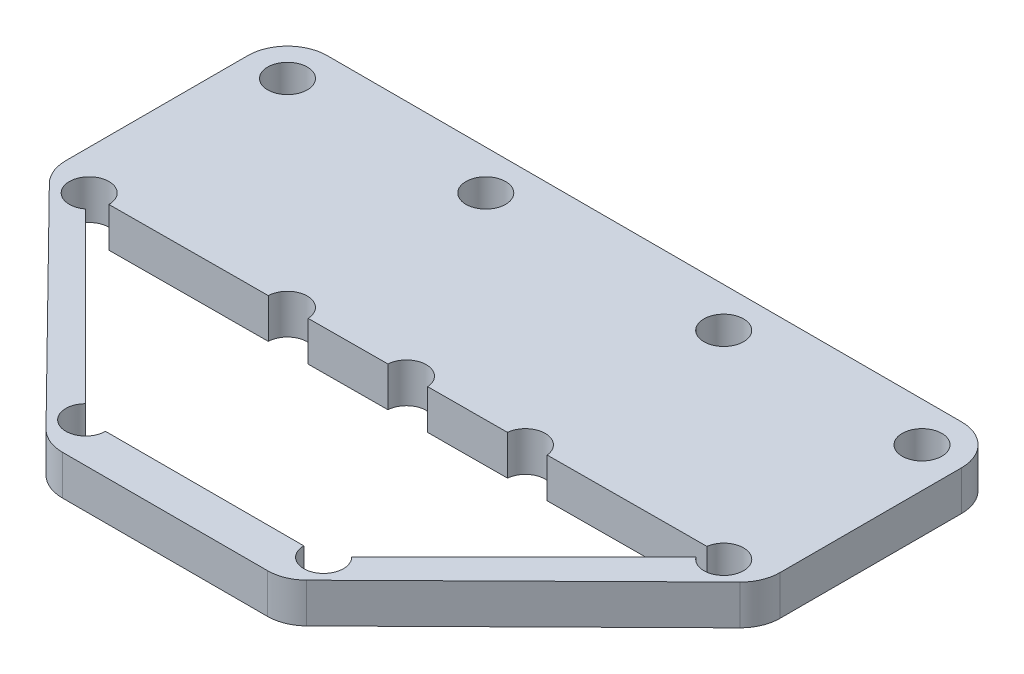
ISO-10303-21;
HEADER;
FILE_DESCRIPTION(('STEP AP214'),'2;1');
FILE_NAME('part.step','',(''),(''),'','','');
FILE_SCHEMA(('AUTOMOTIVE_DESIGN { 1 0 10303 214 1 1 1 1 }'));
ENDSEC;
DATA;
#1=APPLICATION_CONTEXT('core data for automotive mechanical design processes');
#2=APPLICATION_PROTOCOL_DEFINITION('international standard','automotive_design',2000,#1);
#3=PRODUCT_CONTEXT('',#1,'mechanical');
#4=PRODUCT('Part','Part','',(#3));
#5=PRODUCT_RELATED_PRODUCT_CATEGORY('part','',(#4));
#6=PRODUCT_DEFINITION_FORMATION('','',#4);
#7=PRODUCT_DEFINITION_CONTEXT('part definition',#1,'design');
#8=PRODUCT_DEFINITION('design','',#6,#7);
#9=PRODUCT_DEFINITION_SHAPE('','',#8);
#10=(LENGTH_UNIT() NAMED_UNIT(*) SI_UNIT(.MILLI.,.METRE.));
#11=(NAMED_UNIT(*) PLANE_ANGLE_UNIT() SI_UNIT($,.RADIAN.));
#12=(NAMED_UNIT(*) SI_UNIT($,.STERADIAN.) SOLID_ANGLE_UNIT());
#13=UNCERTAINTY_MEASURE_WITH_UNIT(LENGTH_MEASURE(1.E-05),#10,'distance_accuracy_value','');
#14=(GEOMETRIC_REPRESENTATION_CONTEXT(3) GLOBAL_UNCERTAINTY_ASSIGNED_CONTEXT((#13)) GLOBAL_UNIT_ASSIGNED_CONTEXT((#10,
#11,#12)) REPRESENTATION_CONTEXT('',''));
#15=CARTESIAN_POINT('',(0.,0.,0.));
#16=DIRECTION('',(0.,0.,1.));
#17=DIRECTION('',(1.,0.,0.));
#18=AXIS2_PLACEMENT_3D('',#15,#16,#17);
#19=CARTESIAN_POINT('',(-131.471489952786,12.7,-38.2334337337742));
#20=DIRECTION('',(0.,-1.,0.));
#21=DIRECTION('',(0.,0.,-1.));
#22=AXIS2_PLACEMENT_3D('',#19,#20,#21);
#23=CYLINDRICAL_SURFACE('',#22,12.6999999999999);
#24=CARTESIAN_POINT('',(-131.471489952786,0.,-38.2334337337742));
#25=DIRECTION('',(0.,1.,0.));
#26=DIRECTION('',(0.,0.,-1.));
#27=AXIS2_PLACEMENT_3D('',#24,#25,#26);
#28=CIRCLE('',#27,12.6999999999999);
#29=CARTESIAN_POINT('',(-144.171489952786,0.,-38.2334337337742));
#30=VERTEX_POINT('',#29);
#31=CARTESIAN_POINT('',(-140.522107102558,0.,-29.3240942965171));
#32=VERTEX_POINT('',#31);
#33=EDGE_CURVE('E259',#30,#32,#28,.T.);
#34=ORIENTED_EDGE('',*,*,#33,.T.);
#35=DIRECTION('',(0.,-1.,0.));
#36=VECTOR('',#35,1.);
#37=CARTESIAN_POINT('',(-140.522107102558,12.7,-29.3240942965171));
#38=LINE('',#37,#36);
#39=CARTESIAN_POINT('',(-140.522107102558,12.7,-29.3240942965171));
#40=VERTEX_POINT('',#39);
#41=EDGE_CURVE('E382',#40,#32,#38,.T.);
#42=ORIENTED_EDGE('',*,*,#41,.F.);
#43=CARTESIAN_POINT('',(-131.471489952786,12.7,-38.2334337337742));
#44=DIRECTION('',(0.,1.,0.));
#45=DIRECTION('',(0.,0.,-1.));
#46=AXIS2_PLACEMENT_3D('',#43,#44,#45);
#47=CIRCLE('',#46,12.6999999999999);
#48=CARTESIAN_POINT('',(-144.171489952786,12.7,-38.2334337337742));
#49=VERTEX_POINT('',#48);
#50=EDGE_CURVE('E265',#49,#40,#47,.T.);
#51=ORIENTED_EDGE('',*,*,#50,.F.);
#52=DIRECTION('',(0.,-1.,0.));
#53=VECTOR('',#52,1.);
#54=CARTESIAN_POINT('',(-144.171489952786,12.7,-38.2334337337742));
#55=LINE('',#54,#53);
#56=EDGE_CURVE('E303',#49,#30,#55,.T.);
#57=ORIENTED_EDGE('',*,*,#56,.T.);
#58=EDGE_LOOP('',(#34,#42,#51,#57));
#59=FACE_BOUND('',#58,.T.);
#60=ADVANCED_FACE('F39',(#59),#23,.T.);
#61=CARTESIAN_POINT('',(-140.522107102558,12.7,-29.3240942965171));
#62=DIRECTION('',(0.712647019667029,0.,-0.701522790335211));
#63=DIRECTION('',(-0.701522790335211,0.,-0.712647019667029));
#64=AXIS2_PLACEMENT_3D('',#61,#62,#63);
#65=PLANE('',#64);
#66=DIRECTION('',(0.701522790335211,0.,0.712647019667029));
#67=VECTOR('',#66,1.);
#68=CARTESIAN_POINT('',(-140.522107102558,0.,-29.3240942965171));
#69=LINE('',#68,#67);
#70=CARTESIAN_POINT('',(-72.8924409334163,0.,39.3779930775579));
#71=VERTEX_POINT('',#70);
#72=EDGE_CURVE('E307',#32,#71,#69,.T.);
#73=ORIENTED_EDGE('',*,*,#72,.T.);
#74=DIRECTION('',(0.,-1.,0.));
#75=VECTOR('',#74,1.);
#76=CARTESIAN_POINT('',(-72.8924409334163,12.7,39.3779930775579));
#77=LINE('',#76,#75);
#78=CARTESIAN_POINT('',(-72.8924409334163,12.7,39.3779930775579));
#79=VERTEX_POINT('',#78);
#80=EDGE_CURVE('E378',#79,#71,#77,.T.);
#81=ORIENTED_EDGE('',*,*,#80,.F.);
#82=DIRECTION('',(0.701522790335211,0.,0.712647019667029));
#83=VECTOR('',#82,1.);
#84=CARTESIAN_POINT('',(-140.522107102558,12.7,-29.3240942965171));
#85=LINE('',#84,#83);
#86=EDGE_CURVE('E269',#40,#79,#85,.T.);
#87=ORIENTED_EDGE('',*,*,#86,.F.);
#88=ORIENTED_EDGE('',*,*,#41,.T.);
#89=EDGE_LOOP('',(#73,#81,#87,#88));
#90=FACE_BOUND('',#89,.T.);
#91=ADVANCED_FACE('F548',(#90),#65,.F.);
#92=CARTESIAN_POINT('',(-63.8418237836473,12.7,30.4686536403008));
#93=DIRECTION('',(0.,-1.,0.));
#94=DIRECTION('',(0.,0.,-1.));
#95=AXIS2_PLACEMENT_3D('',#92,#93,#94);
#96=CYLINDRICAL_SURFACE('',#95,12.6999999999992);
#97=CARTESIAN_POINT('',(-63.8418237836473,0.,30.4686536403008));
#98=DIRECTION('',(0.,1.,0.));
#99=DIRECTION('',(0.,0.,-1.));
#100=AXIS2_PLACEMENT_3D('',#97,#98,#99);
#101=CIRCLE('',#100,12.6999999999992);
#102=CARTESIAN_POINT('',(-63.8418237836451,0.,43.1686536402999));
#103=VERTEX_POINT('',#102);
#104=EDGE_CURVE('E310',#71,#103,#101,.T.);
#105=ORIENTED_EDGE('',*,*,#104,.T.);
#106=DIRECTION('',(0.,-1.,0.));
#107=VECTOR('',#106,1.);
#108=CARTESIAN_POINT('',(-63.8418237836451,12.7,43.1686536402999));
#109=LINE('',#108,#107);
#110=CARTESIAN_POINT('',(-63.8418237836451,12.7,43.1686536402999));
#111=VERTEX_POINT('',#110);
#112=EDGE_CURVE('E374',#111,#103,#109,.T.);
#113=ORIENTED_EDGE('',*,*,#112,.F.);
#114=CARTESIAN_POINT('',(-63.8418237836473,12.7,30.4686536403008));
#115=DIRECTION('',(0.,1.,0.));
#116=DIRECTION('',(0.,0.,-1.));
#117=AXIS2_PLACEMENT_3D('',#114,#115,#116);
#118=CIRCLE('',#117,12.6999999999992);
#119=EDGE_CURVE('E273',#79,#111,#118,.T.);
#120=ORIENTED_EDGE('',*,*,#119,.F.);
#121=ORIENTED_EDGE('',*,*,#80,.T.);
#122=EDGE_LOOP('',(#105,#113,#120,#121));
#123=FACE_BOUND('',#122,.T.);
#124=ADVANCED_FACE('F553',(#123),#96,.T.);
#125=CARTESIAN_POINT('',(-63.8418237836451,12.7,43.1686536403008));
#126=DIRECTION('',(0.,0.,-1.));
#127=DIRECTION('',(-1.,0.,0.));
#128=AXIS2_PLACEMENT_3D('',#125,#126,#127);
#129=PLANE('',#128);
#130=DIRECTION('',(1.,0.,0.));
#131=VECTOR('',#130,1.);
#132=CARTESIAN_POINT('',(-63.8418237836451,0.,43.1686536403008));
#133=LINE('',#132,#131);
#134=CARTESIAN_POINT('',(1.83605760066149,0.,43.1686536403007));
#135=VERTEX_POINT('',#134);
#136=EDGE_CURVE('E313',#103,#135,#133,.T.);
#137=ORIENTED_EDGE('',*,*,#136,.T.);
#138=DIRECTION('',(0.,-1.,0.));
#139=VECTOR('',#138,1.);
#140=CARTESIAN_POINT('',(1.83605760066149,12.7,43.1686536403007));
#141=LINE('',#140,#139);
#142=CARTESIAN_POINT('',(1.83605760066149,12.7,43.1686536403007));
#143=VERTEX_POINT('',#142);
#144=EDGE_CURVE('E370',#143,#135,#141,.T.);
#145=ORIENTED_EDGE('',*,*,#144,.F.);
#146=DIRECTION('',(1.,0.,0.));
#147=VECTOR('',#146,1.);
#148=CARTESIAN_POINT('',(-63.8418237836451,12.7,43.1686536403008));
#149=LINE('',#148,#147);
#150=EDGE_CURVE('E276',#111,#143,#149,.T.);
#151=ORIENTED_EDGE('',*,*,#150,.F.);
#152=ORIENTED_EDGE('',*,*,#112,.T.);
#153=EDGE_LOOP('',(#137,#145,#151,#152));
#154=FACE_BOUND('',#153,.T.);
#155=ADVANCED_FACE('F605',(#154),#129,.F.);
#156=CARTESIAN_POINT('',(1.83605760065925,12.7,30.4686536403008));
#157=DIRECTION('',(0.,-1.,0.));
#158=DIRECTION('',(0.,0.,-1.));
#159=AXIS2_PLACEMENT_3D('',#156,#157,#158);
#160=CYLINDRICAL_SURFACE('',#159,12.7000000000008);
#161=CARTESIAN_POINT('',(1.83605760065925,0.,30.4686536403008));
#162=DIRECTION('',(0.,1.,0.));
#163=DIRECTION('',(0.,0.,-1.));
#164=AXIS2_PLACEMENT_3D('',#161,#162,#163);
#165=CIRCLE('',#164,12.7000000000008);
#166=CARTESIAN_POINT('',(10.7464996254383,0.,39.5181852813897));
#167=VERTEX_POINT('',#166);
#168=EDGE_CURVE('E316',#135,#167,#165,.T.);
#169=ORIENTED_EDGE('',*,*,#168,.T.);
#170=DIRECTION('',(0.,-1.,0.));
#171=VECTOR('',#170,1.);
#172=CARTESIAN_POINT('',(10.7464996254383,12.7,39.5181852813897));
#173=LINE('',#172,#171);
#174=CARTESIAN_POINT('',(10.7464996254383,12.7,39.5181852813897));
#175=VERTEX_POINT('',#174);
#176=EDGE_CURVE('E366',#175,#167,#173,.T.);
#177=ORIENTED_EDGE('',*,*,#176,.F.);
#178=CARTESIAN_POINT('',(1.83605760065925,12.7,30.4686536403008));
#179=DIRECTION('',(0.,1.,0.));
#180=DIRECTION('',(0.,0.,-1.));
#181=AXIS2_PLACEMENT_3D('',#178,#179,#180);
#182=CIRCLE('',#181,12.7000000000008);
#183=EDGE_CURVE('E279',#143,#175,#182,.T.);
#184=ORIENTED_EDGE('',*,*,#183,.F.);
#185=ORIENTED_EDGE('',*,*,#144,.T.);
#186=EDGE_LOOP('',(#169,#177,#184,#185));
#187=FACE_BOUND('',#186,.T.);
#188=ADVANCED_FACE('F602',(#187),#160,.T.);
#189=CARTESIAN_POINT('',(80.6389520719911,12.7,-29.3000331849449));
#190=DIRECTION('',(-0.701609608250188,0.,-0.712561546542485));
#191=DIRECTION('',(-0.712561546542485,0.,0.701609608250188));
#192=AXIS2_PLACEMENT_3D('',#189,#190,#191);
#193=PLANE('',#192);
#194=DIRECTION('',(0.712561546542485,0.,-0.701609608250188));
#195=VECTOR('',#194,1.);
#196=CARTESIAN_POINT('',(80.6389520719911,0.,-29.3000331849449));
#197=LINE('',#196,#195);
#198=CARTESIAN_POINT('',(80.6389520719911,0.,-29.3000331849449));
#199=VERTEX_POINT('',#198);
#200=EDGE_CURVE('E319',#167,#199,#197,.T.);
#201=ORIENTED_EDGE('',*,*,#200,.T.);
#202=DIRECTION('',(0.,-1.,0.));
#203=VECTOR('',#202,1.);
#204=CARTESIAN_POINT('',(80.6389520719911,12.7,-29.3000331849449));
#205=LINE('',#204,#203);
#206=CARTESIAN_POINT('',(80.6389520719911,12.7,-29.3000331849449));
#207=VERTEX_POINT('',#206);
#208=EDGE_CURVE('E362',#207,#199,#205,.T.);
#209=ORIENTED_EDGE('',*,*,#208,.F.);
#210=DIRECTION('',(0.712561546542485,0.,-0.701609608250188));
#211=VECTOR('',#210,1.);
#212=CARTESIAN_POINT('',(80.6389520719911,12.7,-29.3000331849449));
#213=LINE('',#212,#211);
#214=EDGE_CURVE('E282',#175,#207,#213,.T.);
#215=ORIENTED_EDGE('',*,*,#214,.F.);
#216=ORIENTED_EDGE('',*,*,#176,.T.);
#217=EDGE_LOOP('',(#201,#209,#215,#216));
#218=FACE_BOUND('',#217,.T.);
#219=ADVANCED_FACE('F598',(#218),#193,.F.);
#220=CARTESIAN_POINT('',(71.7285100472137,12.7,-38.3495648260345));
#221=DIRECTION('',(0.,-1.,0.));
#222=DIRECTION('',(0.,0.,-1.));
#223=AXIS2_PLACEMENT_3D('',#220,#221,#222);
#224=CYLINDRICAL_SURFACE('',#223,12.7);
#225=CARTESIAN_POINT('',(71.7285100472137,0.,-38.3495648260345));
#226=DIRECTION('',(0.,1.,0.));
#227=DIRECTION('',(0.,0.,-1.));
#228=AXIS2_PLACEMENT_3D('',#225,#226,#227);
#229=CIRCLE('',#228,12.7);
#230=CARTESIAN_POINT('',(84.4285100472137,0.,-38.3495648260345));
#231=VERTEX_POINT('',#230);
#232=EDGE_CURVE('E322',#199,#231,#229,.T.);
#233=ORIENTED_EDGE('',*,*,#232,.T.);
#234=DIRECTION('',(0.,-1.,0.));
#235=VECTOR('',#234,1.);
#236=CARTESIAN_POINT('',(84.4285100472137,12.7,-38.3495648260345));
#237=LINE('',#236,#235);
#238=CARTESIAN_POINT('',(84.4285100472137,12.7,-38.3495648260345));
#239=VERTEX_POINT('',#238);
#240=EDGE_CURVE('E358',#239,#231,#237,.T.);
#241=ORIENTED_EDGE('',*,*,#240,.F.);
#242=CARTESIAN_POINT('',(71.7285100472137,12.7,-38.3495648260345));
#243=DIRECTION('',(0.,1.,0.));
#244=DIRECTION('',(0.,0.,-1.));
#245=AXIS2_PLACEMENT_3D('',#242,#243,#244);
#246=CIRCLE('',#245,12.7);
#247=EDGE_CURVE('E285',#207,#239,#246,.T.);
#248=ORIENTED_EDGE('',*,*,#247,.F.);
#249=ORIENTED_EDGE('',*,*,#208,.T.);
#250=EDGE_LOOP('',(#233,#241,#248,#249));
#251=FACE_BOUND('',#250,.T.);
#252=ADVANCED_FACE('F593',(#251),#224,.T.);
#253=CARTESIAN_POINT('',(84.4285100472137,12.7,-96.5313463596992));
#254=DIRECTION('',(-1.,0.,0.));
#255=DIRECTION('',(0.,0.,1.));
#256=AXIS2_PLACEMENT_3D('',#253,#254,#255);
#257=PLANE('',#256);
#258=DIRECTION('',(0.,0.,-1.));
#259=VECTOR('',#258,1.);
#260=CARTESIAN_POINT('',(84.4285100472137,0.,-96.5313463596992));
#261=LINE('',#260,#259);
#262=CARTESIAN_POINT('',(84.4285100472137,0.,-96.5313463596992));
#263=VERTEX_POINT('',#262);
#264=EDGE_CURVE('E325',#231,#263,#261,.T.);
#265=ORIENTED_EDGE('',*,*,#264,.T.);
#266=DIRECTION('',(0.,-1.,0.));
#267=VECTOR('',#266,1.);
#268=CARTESIAN_POINT('',(84.4285100472137,12.7,-96.5313463596992));
#269=LINE('',#268,#267);
#270=CARTESIAN_POINT('',(84.4285100472137,12.7,-96.5313463596992));
#271=VERTEX_POINT('',#270);
#272=EDGE_CURVE('E354',#271,#263,#269,.T.);
#273=ORIENTED_EDGE('',*,*,#272,.F.);
#274=DIRECTION('',(0.,0.,-1.));
#275=VECTOR('',#274,1.);
#276=CARTESIAN_POINT('',(84.4285100472137,12.7,-96.5313463596992));
#277=LINE('',#276,#275);
#278=EDGE_CURVE('E288',#239,#271,#277,.T.);
#279=ORIENTED_EDGE('',*,*,#278,.F.);
#280=ORIENTED_EDGE('',*,*,#240,.T.);
#281=EDGE_LOOP('',(#265,#273,#279,#280));
#282=FACE_BOUND('',#281,.T.);
#283=ADVANCED_FACE('F587',(#282),#257,.F.);
#284=CARTESIAN_POINT('',(71.7285100472137,12.7,-96.5313463596993));
#285=DIRECTION('',(0.,-1.,0.));
#286=DIRECTION('',(0.,0.,-1.));
#287=AXIS2_PLACEMENT_3D('',#284,#285,#286);
#288=CYLINDRICAL_SURFACE('',#287,12.7);
#289=CARTESIAN_POINT('',(71.7285100472137,0.,-96.5313463596993));
#290=DIRECTION('',(0.,1.,0.));
#291=DIRECTION('',(0.,0.,1.));
#292=AXIS2_PLACEMENT_3D('',#289,#290,#291);
#293=CIRCLE('',#292,12.7);
#294=CARTESIAN_POINT('',(71.7285100472136,0.,-109.231346359699));
#295=VERTEX_POINT('',#294);
#296=EDGE_CURVE('E328',#263,#295,#293,.T.);
#297=ORIENTED_EDGE('',*,*,#296,.T.);
#298=DIRECTION('',(0.,-1.,0.));
#299=VECTOR('',#298,1.);
#300=CARTESIAN_POINT('',(71.7285100472136,12.7,-109.231346359699));
#301=LINE('',#300,#299);
#302=CARTESIAN_POINT('',(71.7285100472136,12.7,-109.231346359699));
#303=VERTEX_POINT('',#302);
#304=EDGE_CURVE('E350',#303,#295,#301,.T.);
#305=ORIENTED_EDGE('',*,*,#304,.F.);
#306=CARTESIAN_POINT('',(71.7285100472137,12.7,-96.5313463596993));
#307=DIRECTION('',(0.,1.,0.));
#308=DIRECTION('',(0.,0.,1.));
#309=AXIS2_PLACEMENT_3D('',#306,#307,#308);
#310=CIRCLE('',#309,12.7);
#311=EDGE_CURVE('E291',#271,#303,#310,.T.);
#312=ORIENTED_EDGE('',*,*,#311,.F.);
#313=ORIENTED_EDGE('',*,*,#272,.T.);
#314=EDGE_LOOP('',(#297,#305,#312,#313));
#315=FACE_BOUND('',#314,.T.);
#316=ADVANCED_FACE('F583',(#315),#288,.T.);
#317=CARTESIAN_POINT('',(-131.471489952786,12.7,-109.231346359699));
#318=DIRECTION('',(0.,0.,1.));
#319=DIRECTION('',(1.,0.,0.));
#320=AXIS2_PLACEMENT_3D('',#317,#318,#319);
#321=PLANE('',#320);
#322=DIRECTION('',(-1.,0.,0.));
#323=VECTOR('',#322,1.);
#324=CARTESIAN_POINT('',(-131.471489952786,0.,-109.231346359699));
#325=LINE('',#324,#323);
#326=CARTESIAN_POINT('',(-131.471489952786,0.,-109.231346359699));
#327=VERTEX_POINT('',#326);
#328=EDGE_CURVE('E331',#295,#327,#325,.T.);
#329=ORIENTED_EDGE('',*,*,#328,.T.);
#330=DIRECTION('',(0.,-1.,0.));
#331=VECTOR('',#330,1.);
#332=CARTESIAN_POINT('',(-131.471489952786,12.7,-109.231346359699));
#333=LINE('',#332,#331);
#334=CARTESIAN_POINT('',(-131.471489952786,12.7,-109.231346359699));
#335=VERTEX_POINT('',#334);
#336=EDGE_CURVE('E346',#335,#327,#333,.T.);
#337=ORIENTED_EDGE('',*,*,#336,.F.);
#338=DIRECTION('',(-1.,0.,0.));
#339=VECTOR('',#338,1.);
#340=CARTESIAN_POINT('',(-131.471489952786,12.7,-109.231346359699));
#341=LINE('',#340,#339);
#342=EDGE_CURVE('E294',#303,#335,#341,.T.);
#343=ORIENTED_EDGE('',*,*,#342,.F.);
#344=ORIENTED_EDGE('',*,*,#304,.T.);
#345=EDGE_LOOP('',(#329,#337,#343,#344));
#346=FACE_BOUND('',#345,.T.);
#347=ADVANCED_FACE('F578',(#346),#321,.F.);
#348=CARTESIAN_POINT('',(-131.471489952786,12.7,-96.5313463596993));
#349=DIRECTION('',(0.,-1.,0.));
#350=DIRECTION('',(0.,0.,-1.));
#351=AXIS2_PLACEMENT_3D('',#348,#349,#350);
#352=CYLINDRICAL_SURFACE('',#351,12.7);
#353=CARTESIAN_POINT('',(-131.471489952786,0.,-96.5313463596993));
#354=DIRECTION('',(0.,1.,0.));
#355=DIRECTION('',(0.,0.,1.));
#356=AXIS2_PLACEMENT_3D('',#353,#354,#355);
#357=CIRCLE('',#356,12.7);
#358=CARTESIAN_POINT('',(-144.171489952786,0.,-96.5313463596992));
#359=VERTEX_POINT('',#358);
#360=EDGE_CURVE('E334',#327,#359,#357,.T.);
#361=ORIENTED_EDGE('',*,*,#360,.T.);
#362=DIRECTION('',(0.,-1.,0.));
#363=VECTOR('',#362,1.);
#364=CARTESIAN_POINT('',(-144.171489952786,12.7,-96.5313463596992));
#365=LINE('',#364,#363);
#366=CARTESIAN_POINT('',(-144.171489952786,12.7,-96.5313463596992));
#367=VERTEX_POINT('',#366);
#368=EDGE_CURVE('E342',#367,#359,#365,.T.);
#369=ORIENTED_EDGE('',*,*,#368,.F.);
#370=CARTESIAN_POINT('',(-131.471489952786,12.7,-96.5313463596993));
#371=DIRECTION('',(0.,1.,0.));
#372=DIRECTION('',(0.,0.,1.));
#373=AXIS2_PLACEMENT_3D('',#370,#371,#372);
#374=CIRCLE('',#373,12.7);
#375=EDGE_CURVE('E297',#335,#367,#374,.T.);
#376=ORIENTED_EDGE('',*,*,#375,.F.);
#377=ORIENTED_EDGE('',*,*,#336,.T.);
#378=EDGE_LOOP('',(#361,#369,#376,#377));
#379=FACE_BOUND('',#378,.T.);
#380=ADVANCED_FACE('F572',(#379),#352,.T.);
#381=CARTESIAN_POINT('',(-144.171489952786,12.7,-96.5313463596992));
#382=DIRECTION('',(1.,0.,0.));
#383=DIRECTION('',(0.,0.,-1.));
#384=AXIS2_PLACEMENT_3D('',#381,#382,#383);
#385=PLANE('',#384);
#386=DIRECTION('',(0.,0.,1.));
#387=VECTOR('',#386,1.);
#388=CARTESIAN_POINT('',(-144.171489952786,0.,-96.5313463596992));
#389=LINE('',#388,#387);
#390=EDGE_CURVE('E270',#359,#30,#389,.T.);
#391=ORIENTED_EDGE('',*,*,#390,.T.);
#392=ORIENTED_EDGE('',*,*,#56,.F.);
#393=DIRECTION('',(0.,0.,1.));
#394=VECTOR('',#393,1.);
#395=CARTESIAN_POINT('',(-144.171489952786,12.7,-96.5313463596992));
#396=LINE('',#395,#394);
#397=EDGE_CURVE('E300',#367,#49,#396,.T.);
#398=ORIENTED_EDGE('',*,*,#397,.F.);
#399=ORIENTED_EDGE('',*,*,#368,.T.);
#400=EDGE_LOOP('',(#391,#392,#398,#399));
#401=FACE_BOUND('',#400,.T.);
#402=ADVANCED_FACE('F426',(#401),#385,.F.);
#403=CARTESIAN_POINT('',(-131.471489952786,12.7,-38.2334337337742));
#404=DIRECTION('',(0.,-1.,0.));
#405=DIRECTION('',(0.,0.,-1.));
#406=AXIS2_PLACEMENT_3D('',#403,#404,#405);
#407=PLANE('',#406);
#408=CARTESIAN_POINT('',(71.7285100472137,12.7,-96.5313463596992));
#409=DIRECTION('',(0.,1.,0.));
#410=DIRECTION('',(0.,0.,1.));
#411=AXIS2_PLACEMENT_3D('',#408,#409,#410);
#412=CIRCLE('',#411,6.35000000000002);
#413=CARTESIAN_POINT('',(71.7285100472137,12.7,-90.1813463596992));
#414=VERTEX_POINT('',#413);
#415=EDGE_CURVE('E248',#414,#414,#412,.T.);
#416=ORIENTED_EDGE('',*,*,#415,.F.);
#417=EDGE_LOOP('',(#416));
#418=FACE_BOUND('',#417,.T.);
#419=CARTESIAN_POINT('',(-67.9714899527863,12.7,-96.5313463596992));
#420=DIRECTION('',(0.,1.,0.));
#421=DIRECTION('',(0.,0.,1.));
#422=AXIS2_PLACEMENT_3D('',#419,#420,#421);
#423=CIRCLE('',#422,6.34999999999788);
#424=CARTESIAN_POINT('',(-67.9714899527863,12.7,-90.1813463597014));
#425=VERTEX_POINT('',#424);
#426=EDGE_CURVE('E431',#425,#425,#423,.T.);
#427=ORIENTED_EDGE('',*,*,#426,.F.);
#428=EDGE_LOOP('',(#427));
#429=FACE_BOUND('',#428,.T.);
#430=CARTESIAN_POINT('',(8.22851004721369,12.7,-96.5313463596992));
#431=DIRECTION('',(0.,1.,0.));
#432=DIRECTION('',(0.,0.,1.));
#433=AXIS2_PLACEMENT_3D('',#430,#431,#432);
#434=CIRCLE('',#433,6.34999999999787);
#435=CARTESIAN_POINT('',(8.22851004721369,12.7,-90.1813463597014));
#436=VERTEX_POINT('',#435);
#437=EDGE_CURVE('E434',#436,#436,#434,.T.);
#438=ORIENTED_EDGE('',*,*,#437,.F.);
#439=EDGE_LOOP('',(#438));
#440=FACE_BOUND('',#439,.T.);
#441=CARTESIAN_POINT('',(-131.471489952786,12.7,-33.0313463596992));
#442=DIRECTION('',(0.,1.,0.));
#443=DIRECTION('',(0.,0.,1.));
#444=AXIS2_PLACEMENT_3D('',#441,#442,#443);
#445=CIRCLE('',#444,6.35000000000002);
#446=CARTESIAN_POINT('',(-125.121573758562,12.7,-32.99872234517));
#447=VERTEX_POINT('',#446);
#448=CARTESIAN_POINT('',(-127.582836132753,12.7,-28.0112994009609));
#449=VERTEX_POINT('',#448);
#450=EDGE_CURVE('E416',#447,#449,#445,.T.);
#451=ORIENTED_EDGE('',*,*,#450,.F.);
#452=DIRECTION('',(-0.999988128165705,0.,0.0048727330780026));
#453=VECTOR('',#452,1.);
#454=CARTESIAN_POINT('',(71.5226993236938,12.7,-33.9569287748856));
#455=LINE('',#454,#453);
#456=CARTESIAN_POINT('',(-74.3175013329338,12.7,-33.2462799683387));
#457=VERTEX_POINT('',#456);
#458=EDGE_CURVE('E239',#457,#447,#455,.T.);
#459=ORIENTED_EDGE('',*,*,#458,.F.);
#460=CARTESIAN_POINT('',(-67.9714892860843,12.7,-33.0212664105009));
#461=DIRECTION('',(0.,1.,0.));
#462=DIRECTION('',(0.,0.,1.));
#463=AXIS2_PLACEMENT_3D('',#460,#461,#462);
#464=CIRCLE('',#463,6.34999999999761);
#465=CARTESIAN_POINT('',(-61.6279714286391,12.7,-33.3081133945238));
#466=VERTEX_POINT('',#465);
#467=EDGE_CURVE('E406',#466,#457,#464,.T.);
#468=ORIENTED_EDGE('',*,*,#467,.F.);
#469=CARTESIAN_POINT('',(-36.2088399301736,12.7,-33.431975507861));
#470=VERTEX_POINT('',#469);
#471=EDGE_CURVE('E460',#470,#466,#455,.T.);
#472=ORIENTED_EDGE('',*,*,#471,.F.);
#473=CARTESIAN_POINT('',(-29.8714906194882,12.7,-33.0313463597001));
#474=DIRECTION('',(0.,1.,0.));
#475=DIRECTION('',(0.,0.,1.));
#476=AXIS2_PLACEMENT_3D('',#473,#474,#475);
#477=CIRCLE('',#476,6.35);
#478=CARTESIAN_POINT('',(-23.5383465223132,12.7,-33.493716173179));
#479=VERTEX_POINT('',#478);
#480=EDGE_CURVE('E260',#479,#470,#477,.T.);
#481=ORIENTED_EDGE('',*,*,#480,.F.);
#482=CARTESIAN_POINT('',(1.90563964570304,12.7,-33.6176993981245));
#483=VERTEX_POINT('',#482);
#484=EDGE_CURVE('E237',#483,#479,#455,.T.);
#485=ORIENTED_EDGE('',*,*,#484,.F.);
#486=CARTESIAN_POINT('',(8.22851004721373,12.7,-33.0313463597001));
#487=DIRECTION('',(0.,1.,0.));
#488=DIRECTION('',(0.,0.,1.));
#489=AXIS2_PLACEMENT_3D('',#486,#487,#488);
#490=CIRCLE('',#489,6.3499999999976);
#491=CARTESIAN_POINT('',(14.5453659783756,12.7,-33.6792901419177));
#492=VERTEX_POINT('',#491);
#493=EDGE_CURVE('E235',#492,#483,#490,.T.);
#494=ORIENTED_EDGE('',*,*,#493,.F.);
#495=CARTESIAN_POINT('',(65.4420349679464,12.7,-33.927298968783));
#496=VERTEX_POINT('',#495);
#497=EDGE_CURVE('E214',#496,#492,#455,.T.);
#498=ORIENTED_EDGE('',*,*,#497,.F.);
#499=CARTESIAN_POINT('',(71.7285100472137,12.7,-33.0313463596992));
#500=DIRECTION('',(0.,1.,0.));
#501=DIRECTION('',(0.,0.,1.));
#502=AXIS2_PLACEMENT_3D('',#499,#500,#501);
#503=CIRCLE('',#502,6.34999999999789);
#504=CARTESIAN_POINT('',(66.7084630884762,12.7,-29.142692539668));
#505=VERTEX_POINT('',#504);
#506=EDGE_CURVE('E232',#505,#496,#503,.T.);
#507=ORIENTED_EDGE('',*,*,#506,.F.);
#508=DIRECTION('',(0.707106781186547,0.,-0.707106781186547));
#509=VECTOR('',#508,1.);
#510=CARTESIAN_POINT('',(7.09711690850821,12.7,30.4686536403));
#511=LINE('',#510,#509);
#512=CARTESIAN_POINT('',(11.5872449690411,12.7,25.9785255797671));
#513=VERTEX_POINT('',#512);
#514=EDGE_CURVE('E473',#513,#505,#511,.T.);
#515=ORIENTED_EDGE('',*,*,#514,.F.);
#516=CARTESIAN_POINT('',(7.09711690850821,12.7,30.4686536403));
#517=DIRECTION('',(0.,1.,0.));
#518=DIRECTION('',(0.,0.,1.));
#519=AXIS2_PLACEMENT_3D('',#516,#517,#518);
#520=CIRCLE('',#519,6.34999999999761);
#521=CARTESIAN_POINT('',(0.747116908510603,12.7,30.4686536403));
#522=VERTEX_POINT('',#521);
#523=EDGE_CURVE('E409',#522,#513,#520,.T.);
#524=ORIENTED_EDGE('',*,*,#523,.F.);
#525=DIRECTION('',(1.,0.,0.));
#526=VECTOR('',#525,1.);
#527=CARTESIAN_POINT('',(-69.1028830914918,12.7,30.4686536402999));
#528=LINE('',#527,#526);
#529=CARTESIAN_POINT('',(-62.7528830914942,12.7,30.4686536402999));
#530=VERTEX_POINT('',#529);
#531=EDGE_CURVE('E400',#530,#522,#528,.T.);
#532=ORIENTED_EDGE('',*,*,#531,.F.);
#533=CARTESIAN_POINT('',(-69.1028830914918,12.7,30.4686536402999));
#534=DIRECTION('',(0.,1.,0.));
#535=DIRECTION('',(0.,0.,1.));
#536=AXIS2_PLACEMENT_3D('',#533,#534,#535);
#537=CIRCLE('',#536,6.34999999999762);
#538=CARTESIAN_POINT('',(-73.5930111520247,12.7,25.9785255797671));
#539=VERTEX_POINT('',#538);
#540=EDGE_CURVE('E393',#539,#530,#537,.T.);
#541=ORIENTED_EDGE('',*,*,#540,.F.);
#542=DIRECTION('',(0.707106781186549,0.,0.707106781186546));
#543=VECTOR('',#542,1.);
#544=CARTESIAN_POINT('',(-132.534139195356,12.7,-32.962602463564));
#545=LINE('',#544,#543);
#546=EDGE_CURVE('E62',#449,#539,#545,.T.);
#547=ORIENTED_EDGE('',*,*,#546,.F.);
#548=EDGE_LOOP('',(#451,#459,#468,#472,#481,#485,#494,#498,#507,#515,#524,#532,#541,#547));
#549=FACE_BOUND('',#548,.T.);
#550=CARTESIAN_POINT('',(-131.471489952786,12.7,-96.5313463596992));
#551=DIRECTION('',(0.,1.,0.));
#552=DIRECTION('',(0.,0.,1.));
#553=AXIS2_PLACEMENT_3D('',#550,#551,#552);
#554=CIRCLE('',#553,6.35000000000002);
#555=CARTESIAN_POINT('',(-131.471489952786,12.7,-90.1813463596992));
#556=VERTEX_POINT('',#555);
#557=EDGE_CURVE('E518',#556,#556,#554,.T.);
#558=ORIENTED_EDGE('',*,*,#557,.F.);
#559=EDGE_LOOP('',(#558));
#560=FACE_BOUND('',#559,.T.);
#561=ORIENTED_EDGE('',*,*,#50,.T.);
#562=ORIENTED_EDGE('',*,*,#86,.T.);
#563=ORIENTED_EDGE('',*,*,#119,.T.);
#564=ORIENTED_EDGE('',*,*,#150,.T.);
#565=ORIENTED_EDGE('',*,*,#183,.T.);
#566=ORIENTED_EDGE('',*,*,#214,.T.);
#567=ORIENTED_EDGE('',*,*,#247,.T.);
#568=ORIENTED_EDGE('',*,*,#278,.T.);
#569=ORIENTED_EDGE('',*,*,#311,.T.);
#570=ORIENTED_EDGE('',*,*,#342,.T.);
#571=ORIENTED_EDGE('',*,*,#375,.T.);
#572=ORIENTED_EDGE('',*,*,#397,.T.);
#573=EDGE_LOOP('',(#561,#562,#563,#564,#565,#566,#567,#568,#569,#570,#571,#572));
#574=FACE_BOUND('',#573,.T.);
#575=ADVANCED_FACE('F229',(#418,#429,#440,#549,#560,#574),#407,.F.);
#576=CARTESIAN_POINT('',(-131.471489952786,0.,-38.2334337337742));
#577=DIRECTION('',(0.,-1.,0.));
#578=DIRECTION('',(0.,0.,-1.));
#579=AXIS2_PLACEMENT_3D('',#576,#577,#578);
#580=PLANE('',#579);
#581=DIRECTION('',(-0.999988128165705,0.,0.0048727330780026));
#582=VECTOR('',#581,1.);
#583=CARTESIAN_POINT('',(71.5226993236938,0.,-33.9569287748856));
#584=LINE('',#583,#582);
#585=CARTESIAN_POINT('',(-74.3175013329338,0.,-33.2462799683387));
#586=VERTEX_POINT('',#585);
#587=CARTESIAN_POINT('',(-125.121573758562,0.,-32.99872234517));
#588=VERTEX_POINT('',#587);
#589=EDGE_CURVE('E476',#586,#588,#584,.T.);
#590=ORIENTED_EDGE('',*,*,#589,.T.);
#591=CARTESIAN_POINT('',(-131.471489952786,0.,-33.0313463596992));
#592=DIRECTION('',(0.,1.,0.));
#593=DIRECTION('',(0.,0.,1.));
#594=AXIS2_PLACEMENT_3D('',#591,#592,#593);
#595=CIRCLE('',#594,6.35000000000002);
#596=CARTESIAN_POINT('',(-127.582836132753,0.,-28.0112994009609));
#597=VERTEX_POINT('',#596);
#598=EDGE_CURVE('E522',#588,#597,#595,.T.);
#599=ORIENTED_EDGE('',*,*,#598,.T.);
#600=DIRECTION('',(0.707106781186549,0.,0.707106781186546));
#601=VECTOR('',#600,1.);
#602=CARTESIAN_POINT('',(-132.534139195356,0.,-32.962602463564));
#603=LINE('',#602,#601);
#604=CARTESIAN_POINT('',(-73.5930111520247,0.,25.9785255797671));
#605=VERTEX_POINT('',#604);
#606=EDGE_CURVE('E762',#597,#605,#603,.T.);
#607=ORIENTED_EDGE('',*,*,#606,.T.);
#608=CARTESIAN_POINT('',(-69.1028830914918,0.,30.4686536402999));
#609=DIRECTION('',(0.,1.,0.));
#610=DIRECTION('',(0.,0.,1.));
#611=AXIS2_PLACEMENT_3D('',#608,#609,#610);
#612=CIRCLE('',#611,6.34999999999762);
#613=CARTESIAN_POINT('',(-62.7528830914942,0.,30.4686536402999));
#614=VERTEX_POINT('',#613);
#615=EDGE_CURVE('E395',#605,#614,#612,.T.);
#616=ORIENTED_EDGE('',*,*,#615,.T.);
#617=DIRECTION('',(1.,0.,0.));
#618=VECTOR('',#617,1.);
#619=CARTESIAN_POINT('',(-69.1028830914918,0.,30.4686536402999));
#620=LINE('',#619,#618);
#621=CARTESIAN_POINT('',(0.747116908510603,0.,30.4686536403));
#622=VERTEX_POINT('',#621);
#623=EDGE_CURVE('E758',#614,#622,#620,.T.);
#624=ORIENTED_EDGE('',*,*,#623,.T.);
#625=CARTESIAN_POINT('',(7.09711690850821,0.,30.4686536403));
#626=DIRECTION('',(0.,1.,0.));
#627=DIRECTION('',(0.,0.,1.));
#628=AXIS2_PLACEMENT_3D('',#625,#626,#627);
#629=CIRCLE('',#628,6.34999999999761);
#630=CARTESIAN_POINT('',(11.5872449690411,0.,25.9785255797671));
#631=VERTEX_POINT('',#630);
#632=EDGE_CURVE('E402',#622,#631,#629,.T.);
#633=ORIENTED_EDGE('',*,*,#632,.T.);
#634=DIRECTION('',(0.707106781186547,0.,-0.707106781186547));
#635=VECTOR('',#634,1.);
#636=CARTESIAN_POINT('',(7.09711690850821,0.,30.4686536403));
#637=LINE('',#636,#635);
#638=CARTESIAN_POINT('',(66.7084630884762,0.,-29.142692539668));
#639=VERTEX_POINT('',#638);
#640=EDGE_CURVE('E467',#631,#639,#637,.T.);
#641=ORIENTED_EDGE('',*,*,#640,.T.);
#642=CARTESIAN_POINT('',(71.7285100472137,0.,-33.0313463596992));
#643=DIRECTION('',(0.,1.,0.));
#644=DIRECTION('',(0.,0.,1.));
#645=AXIS2_PLACEMENT_3D('',#642,#643,#644);
#646=CIRCLE('',#645,6.34999999999789);
#647=CARTESIAN_POINT('',(65.4420349679464,0.,-33.927298968783));
#648=VERTEX_POINT('',#647);
#649=EDGE_CURVE('E243',#639,#648,#646,.T.);
#650=ORIENTED_EDGE('',*,*,#649,.T.);
#651=CARTESIAN_POINT('',(14.5453659783756,0.,-33.6792901419177));
#652=VERTEX_POINT('',#651);
#653=EDGE_CURVE('E217',#648,#652,#584,.T.);
#654=ORIENTED_EDGE('',*,*,#653,.T.);
#655=CARTESIAN_POINT('',(8.22851004721373,0.,-33.0313463597001));
#656=DIRECTION('',(0.,1.,0.));
#657=DIRECTION('',(0.,0.,1.));
#658=AXIS2_PLACEMENT_3D('',#655,#656,#657);
#659=CIRCLE('',#658,6.3499999999976);
#660=CARTESIAN_POINT('',(1.90563964570304,0.,-33.6176993981245));
#661=VERTEX_POINT('',#660);
#662=EDGE_CURVE('E508',#652,#661,#659,.T.);
#663=ORIENTED_EDGE('',*,*,#662,.T.);
#664=CARTESIAN_POINT('',(-23.5383465223132,0.,-33.493716173179));
#665=VERTEX_POINT('',#664);
#666=EDGE_CURVE('E54',#661,#665,#584,.T.);
#667=ORIENTED_EDGE('',*,*,#666,.T.);
#668=CARTESIAN_POINT('',(-29.8714906194882,0.,-33.0313463597001));
#669=DIRECTION('',(0.,1.,0.));
#670=DIRECTION('',(0.,0.,1.));
#671=AXIS2_PLACEMENT_3D('',#668,#669,#670);
#672=CIRCLE('',#671,6.35);
#673=CARTESIAN_POINT('',(-36.2088399301736,0.,-33.431975507861));
#674=VERTEX_POINT('',#673);
#675=EDGE_CURVE('E255',#665,#674,#672,.T.);
#676=ORIENTED_EDGE('',*,*,#675,.T.);
#677=CARTESIAN_POINT('',(-61.6279714286391,0.,-33.3081133945238));
#678=VERTEX_POINT('',#677);
#679=EDGE_CURVE('E768',#674,#678,#584,.T.);
#680=ORIENTED_EDGE('',*,*,#679,.T.);
#681=CARTESIAN_POINT('',(-67.9714892860843,0.,-33.0212664105009));
#682=DIRECTION('',(0.,1.,0.));
#683=DIRECTION('',(0.,0.,1.));
#684=AXIS2_PLACEMENT_3D('',#681,#682,#683);
#685=CIRCLE('',#684,6.34999999999761);
#686=EDGE_CURVE('E438',#678,#586,#685,.T.);
#687=ORIENTED_EDGE('',*,*,#686,.T.);
#688=EDGE_LOOP('',(#590,#599,#607,#616,#624,#633,#641,#650,#654,#663,#667,#676,#680,#687));
#689=FACE_BOUND('',#688,.T.);
#690=CARTESIAN_POINT('',(71.7285100472137,0.,-96.5313463596992));
#691=DIRECTION('',(0.,1.,0.));
#692=DIRECTION('',(0.,0.,1.));
#693=AXIS2_PLACEMENT_3D('',#690,#691,#692);
#694=CIRCLE('',#693,6.35000000000002);
#695=CARTESIAN_POINT('',(71.7285100472137,0.,-90.1813463596992));
#696=VERTEX_POINT('',#695);
#697=EDGE_CURVE('E413',#696,#696,#694,.T.);
#698=ORIENTED_EDGE('',*,*,#697,.T.);
#699=EDGE_LOOP('',(#698));
#700=FACE_BOUND('',#699,.T.);
#701=CARTESIAN_POINT('',(-67.9714899527863,0.,-96.5313463596992));
#702=DIRECTION('',(0.,1.,0.));
#703=DIRECTION('',(0.,0.,1.));
#704=AXIS2_PLACEMENT_3D('',#701,#702,#703);
#705=CIRCLE('',#704,6.34999999999788);
#706=CARTESIAN_POINT('',(-67.9714899527863,0.,-90.1813463597014));
#707=VERTEX_POINT('',#706);
#708=EDGE_CURVE('E264',#707,#707,#705,.T.);
#709=ORIENTED_EDGE('',*,*,#708,.T.);
#710=EDGE_LOOP('',(#709));
#711=FACE_BOUND('',#710,.T.);
#712=CARTESIAN_POINT('',(8.22851004721369,0.,-96.5313463596992));
#713=DIRECTION('',(0.,1.,0.));
#714=DIRECTION('',(0.,0.,1.));
#715=AXIS2_PLACEMENT_3D('',#712,#713,#714);
#716=CIRCLE('',#715,6.34999999999787);
#717=CARTESIAN_POINT('',(8.22851004721369,0.,-90.1813463597014));
#718=VERTEX_POINT('',#717);
#719=EDGE_CURVE('E437',#718,#718,#716,.T.);
#720=ORIENTED_EDGE('',*,*,#719,.T.);
#721=EDGE_LOOP('',(#720));
#722=FACE_BOUND('',#721,.T.);
#723=CARTESIAN_POINT('',(-131.471489952786,0.,-96.5313463596992));
#724=DIRECTION('',(0.,1.,0.));
#725=DIRECTION('',(0.,0.,1.));
#726=AXIS2_PLACEMENT_3D('',#723,#724,#725);
#727=CIRCLE('',#726,6.35000000000002);
#728=CARTESIAN_POINT('',(-131.471489952786,0.,-90.1813463596992));
#729=VERTEX_POINT('',#728);
#730=EDGE_CURVE('E514',#729,#729,#727,.T.);
#731=ORIENTED_EDGE('',*,*,#730,.T.);
#732=EDGE_LOOP('',(#731));
#733=FACE_BOUND('',#732,.T.);
#734=ORIENTED_EDGE('',*,*,#33,.F.);
#735=ORIENTED_EDGE('',*,*,#390,.F.);
#736=ORIENTED_EDGE('',*,*,#360,.F.);
#737=ORIENTED_EDGE('',*,*,#328,.F.);
#738=ORIENTED_EDGE('',*,*,#296,.F.);
#739=ORIENTED_EDGE('',*,*,#264,.F.);
#740=ORIENTED_EDGE('',*,*,#232,.F.);
#741=ORIENTED_EDGE('',*,*,#200,.F.);
#742=ORIENTED_EDGE('',*,*,#168,.F.);
#743=ORIENTED_EDGE('',*,*,#136,.F.);
#744=ORIENTED_EDGE('',*,*,#104,.F.);
#745=ORIENTED_EDGE('',*,*,#72,.F.);
#746=EDGE_LOOP('',(#734,#735,#736,#737,#738,#739,#740,#741,#742,#743,#744,#745));
#747=FACE_BOUND('',#746,.T.);
#748=ADVANCED_FACE('F425',(#689,#700,#711,#722,#733,#747),#580,.T.);
#749=CARTESIAN_POINT('',(-29.8714906194882,0.,-33.0313463597001));
#750=DIRECTION('',(0.,1.,0.));
#751=DIRECTION('',(0.,0.,1.));
#752=AXIS2_PLACEMENT_3D('',#749,#750,#751);
#753=CYLINDRICAL_SURFACE('',#752,6.35);
#754=ORIENTED_EDGE('',*,*,#480,.T.);
#755=DIRECTION('',(0.,1.,0.));
#756=VECTOR('',#755,1.);
#757=CARTESIAN_POINT('',(-36.2088399301736,0.,-33.431975507861));
#758=LINE('',#757,#756);
#759=EDGE_CURVE('E498',#470,#674,#758,.F.);
#760=ORIENTED_EDGE('',*,*,#759,.T.);
#761=ORIENTED_EDGE('',*,*,#675,.F.);
#762=DIRECTION('',(0.,1.,0.));
#763=VECTOR('',#762,1.);
#764=CARTESIAN_POINT('',(-23.5383465223132,0.,-33.493716173179));
#765=LINE('',#764,#763);
#766=EDGE_CURVE('E494',#665,#479,#765,.T.);
#767=ORIENTED_EDGE('',*,*,#766,.T.);
#768=EDGE_LOOP('',(#754,#760,#761,#767));
#769=FACE_BOUND('',#768,.T.);
#770=ADVANCED_FACE('F633',(#769),#753,.F.);
#771=CARTESIAN_POINT('',(-131.471489952786,0.,-33.0313463596992));
#772=DIRECTION('',(0.,1.,0.));
#773=DIRECTION('',(0.,0.,1.));
#774=AXIS2_PLACEMENT_3D('',#771,#772,#773);
#775=CYLINDRICAL_SURFACE('',#774,6.35000000000002);
#776=ORIENTED_EDGE('',*,*,#598,.F.);
#777=DIRECTION('',(0.,1.,0.));
#778=VECTOR('',#777,1.);
#779=CARTESIAN_POINT('',(-125.121573758562,0.,-32.99872234517));
#780=LINE('',#779,#778);
#781=EDGE_CURVE('E491',#588,#447,#780,.T.);
#782=ORIENTED_EDGE('',*,*,#781,.T.);
#783=ORIENTED_EDGE('',*,*,#450,.T.);
#784=DIRECTION('',(0.,1.,0.));
#785=VECTOR('',#784,1.);
#786=CARTESIAN_POINT('',(-127.582836132753,0.,-28.0112994009609));
#787=LINE('',#786,#785);
#788=EDGE_CURVE('E251',#449,#597,#787,.F.);
#789=ORIENTED_EDGE('',*,*,#788,.T.);
#790=EDGE_LOOP('',(#776,#782,#783,#789));
#791=FACE_BOUND('',#790,.T.);
#792=ADVANCED_FACE('F638',(#791),#775,.F.);
#793=CARTESIAN_POINT('',(-131.471489952786,0.,-96.5313463596992));
#794=DIRECTION('',(0.,1.,0.));
#795=DIRECTION('',(0.,0.,1.));
#796=AXIS2_PLACEMENT_3D('',#793,#794,#795);
#797=CYLINDRICAL_SURFACE('',#796,6.35000000000002);
#798=ORIENTED_EDGE('',*,*,#730,.F.);
#799=EDGE_LOOP('',(#798));
#800=FACE_BOUND('',#799,.T.);
#801=ORIENTED_EDGE('',*,*,#557,.T.);
#802=EDGE_LOOP('',(#801));
#803=FACE_BOUND('',#802,.T.);
#804=ADVANCED_FACE('F663',(#800,#803),#797,.F.);
#805=CARTESIAN_POINT('',(8.22851004721373,0.,-33.0313463597001));
#806=DIRECTION('',(0.,1.,0.));
#807=DIRECTION('',(0.,0.,1.));
#808=AXIS2_PLACEMENT_3D('',#805,#806,#807);
#809=CYLINDRICAL_SURFACE('',#808,6.3499999999976);
#810=ORIENTED_EDGE('',*,*,#493,.T.);
#811=DIRECTION('',(0.,1.,0.));
#812=VECTOR('',#811,1.);
#813=CARTESIAN_POINT('',(1.90563964570304,0.,-33.6176993981245));
#814=LINE('',#813,#812);
#815=EDGE_CURVE('E488',#483,#661,#814,.F.);
#816=ORIENTED_EDGE('',*,*,#815,.T.);
#817=ORIENTED_EDGE('',*,*,#662,.F.);
#818=DIRECTION('',(0.,1.,0.));
#819=VECTOR('',#818,1.);
#820=CARTESIAN_POINT('',(14.5453659783756,0.,-33.6792901419177));
#821=LINE('',#820,#819);
#822=EDGE_CURVE('E485',#652,#492,#821,.T.);
#823=ORIENTED_EDGE('',*,*,#822,.T.);
#824=EDGE_LOOP('',(#810,#816,#817,#823));
#825=FACE_BOUND('',#824,.T.);
#826=ADVANCED_FACE('F706',(#825),#809,.F.);
#827=CARTESIAN_POINT('',(7.09711690850821,0.,30.4686536403));
#828=DIRECTION('',(0.,1.,0.));
#829=DIRECTION('',(0.,0.,1.));
#830=AXIS2_PLACEMENT_3D('',#827,#828,#829);
#831=CYLINDRICAL_SURFACE('',#830,6.34999999999761);
#832=ORIENTED_EDGE('',*,*,#523,.T.);
#833=DIRECTION('',(0.,1.,0.));
#834=VECTOR('',#833,1.);
#835=CARTESIAN_POINT('',(11.5872449690411,0.,25.9785255797671));
#836=LINE('',#835,#834);
#837=EDGE_CURVE('E477',#513,#631,#836,.F.);
#838=ORIENTED_EDGE('',*,*,#837,.T.);
#839=ORIENTED_EDGE('',*,*,#632,.F.);
#840=DIRECTION('',(0.,1.,0.));
#841=VECTOR('',#840,1.);
#842=CARTESIAN_POINT('',(0.747116908510602,0.,30.4686536403));
#843=LINE('',#842,#841);
#844=EDGE_CURVE('E244',#622,#522,#843,.T.);
#845=ORIENTED_EDGE('',*,*,#844,.T.);
#846=EDGE_LOOP('',(#832,#838,#839,#845));
#847=FACE_BOUND('',#846,.T.);
#848=ADVANCED_FACE('F645',(#847),#831,.F.);
#849=CARTESIAN_POINT('',(-69.1028830914918,0.,30.4686536402999));
#850=DIRECTION('',(0.,1.,0.));
#851=DIRECTION('',(0.,0.,1.));
#852=AXIS2_PLACEMENT_3D('',#849,#850,#851);
#853=CYLINDRICAL_SURFACE('',#852,6.34999999999762);
#854=ORIENTED_EDGE('',*,*,#540,.T.);
#855=DIRECTION('',(0.,1.,0.));
#856=VECTOR('',#855,1.);
#857=CARTESIAN_POINT('',(-62.7528830914942,0.,30.4686536402999));
#858=LINE('',#857,#856);
#859=EDGE_CURVE('E11',#530,#614,#858,.F.);
#860=ORIENTED_EDGE('',*,*,#859,.T.);
#861=ORIENTED_EDGE('',*,*,#615,.F.);
#862=DIRECTION('',(0.,1.,0.));
#863=VECTOR('',#862,1.);
#864=CARTESIAN_POINT('',(-73.5930111520247,0.,25.9785255797671));
#865=LINE('',#864,#863);
#866=EDGE_CURVE('E47',#605,#539,#865,.T.);
#867=ORIENTED_EDGE('',*,*,#866,.T.);
#868=EDGE_LOOP('',(#854,#860,#861,#867));
#869=FACE_BOUND('',#868,.T.);
#870=ADVANCED_FACE('F392',(#869),#853,.F.);
#871=CARTESIAN_POINT('',(-67.9714892860843,0.,-33.0212664105009));
#872=DIRECTION('',(0.,1.,0.));
#873=DIRECTION('',(0.,0.,1.));
#874=AXIS2_PLACEMENT_3D('',#871,#872,#873);
#875=CYLINDRICAL_SURFACE('',#874,6.34999999999761);
#876=ORIENTED_EDGE('',*,*,#467,.T.);
#877=DIRECTION('',(0.,1.,0.));
#878=VECTOR('',#877,1.);
#879=CARTESIAN_POINT('',(-74.3175013329338,0.,-33.2462799683387));
#880=LINE('',#879,#878);
#881=EDGE_CURVE('E455',#457,#586,#880,.F.);
#882=ORIENTED_EDGE('',*,*,#881,.T.);
#883=ORIENTED_EDGE('',*,*,#686,.F.);
#884=DIRECTION('',(0.,1.,0.));
#885=VECTOR('',#884,1.);
#886=CARTESIAN_POINT('',(-61.6279714286391,0.,-33.3081133945238));
#887=LINE('',#886,#885);
#888=EDGE_CURVE('E456',#678,#466,#887,.T.);
#889=ORIENTED_EDGE('',*,*,#888,.T.);
#890=EDGE_LOOP('',(#876,#882,#883,#889));
#891=FACE_BOUND('',#890,.T.);
#892=ADVANCED_FACE('F453',(#891),#875,.F.);
#893=CARTESIAN_POINT('',(8.22851004721369,0.,-96.5313463596992));
#894=DIRECTION('',(0.,1.,0.));
#895=DIRECTION('',(0.,0.,1.));
#896=AXIS2_PLACEMENT_3D('',#893,#894,#895);
#897=CYLINDRICAL_SURFACE('',#896,6.34999999999787);
#898=ORIENTED_EDGE('',*,*,#719,.F.);
#899=EDGE_LOOP('',(#898));
#900=FACE_BOUND('',#899,.T.);
#901=ORIENTED_EDGE('',*,*,#437,.T.);
#902=EDGE_LOOP('',(#901));
#903=FACE_BOUND('',#902,.T.);
#904=ADVANCED_FACE('F534',(#900,#903),#897,.F.);
#905=CARTESIAN_POINT('',(-67.9714899527863,0.,-96.5313463596992));
#906=DIRECTION('',(0.,1.,0.));
#907=DIRECTION('',(0.,0.,1.));
#908=AXIS2_PLACEMENT_3D('',#905,#906,#907);
#909=CYLINDRICAL_SURFACE('',#908,6.34999999999788);
#910=ORIENTED_EDGE('',*,*,#708,.F.);
#911=EDGE_LOOP('',(#910));
#912=FACE_BOUND('',#911,.T.);
#913=ORIENTED_EDGE('',*,*,#426,.T.);
#914=EDGE_LOOP('',(#913));
#915=FACE_BOUND('',#914,.T.);
#916=ADVANCED_FACE('F532',(#912,#915),#909,.F.);
#917=CARTESIAN_POINT('',(71.7285100472137,0.,-96.5313463596992));
#918=DIRECTION('',(0.,1.,0.));
#919=DIRECTION('',(0.,0.,1.));
#920=AXIS2_PLACEMENT_3D('',#917,#918,#919);
#921=CYLINDRICAL_SURFACE('',#920,6.35000000000002);
#922=ORIENTED_EDGE('',*,*,#697,.F.);
#923=EDGE_LOOP('',(#922));
#924=FACE_BOUND('',#923,.T.);
#925=ORIENTED_EDGE('',*,*,#415,.T.);
#926=EDGE_LOOP('',(#925));
#927=FACE_BOUND('',#926,.T.);
#928=ADVANCED_FACE('F421',(#924,#927),#921,.F.);
#929=CARTESIAN_POINT('',(71.7285100472137,0.,-33.0313463596992));
#930=DIRECTION('',(0.,1.,0.));
#931=DIRECTION('',(0.,0.,1.));
#932=AXIS2_PLACEMENT_3D('',#929,#930,#931);
#933=CYLINDRICAL_SURFACE('',#932,6.34999999999789);
#934=ORIENTED_EDGE('',*,*,#506,.T.);
#935=DIRECTION('',(0.,1.,0.));
#936=VECTOR('',#935,1.);
#937=CARTESIAN_POINT('',(65.4420349679464,0.,-33.927298968783));
#938=LINE('',#937,#936);
#939=EDGE_CURVE('E211',#496,#648,#938,.F.);
#940=ORIENTED_EDGE('',*,*,#939,.T.);
#941=ORIENTED_EDGE('',*,*,#649,.F.);
#942=DIRECTION('',(0.,1.,0.));
#943=VECTOR('',#942,1.);
#944=CARTESIAN_POINT('',(66.7084630884762,0.,-29.142692539668));
#945=LINE('',#944,#943);
#946=EDGE_CURVE('E223',#639,#505,#945,.T.);
#947=ORIENTED_EDGE('',*,*,#946,.T.);
#948=EDGE_LOOP('',(#934,#940,#941,#947));
#949=FACE_BOUND('',#948,.T.);
#950=ADVANCED_FACE('F241',(#949),#933,.F.);
#951=CARTESIAN_POINT('',(7.09711690850821,0.,30.4686536403));
#952=DIRECTION('',(0.707106781186548,0.,0.707106781186548));
#953=DIRECTION('',(0.707106781186548,0.,-0.707106781186548));
#954=AXIS2_PLACEMENT_3D('',#951,#952,#953);
#955=PLANE('',#954);
#956=ORIENTED_EDGE('',*,*,#514,.T.);
#957=ORIENTED_EDGE('',*,*,#946,.F.);
#958=ORIENTED_EDGE('',*,*,#640,.F.);
#959=ORIENTED_EDGE('',*,*,#837,.F.);
#960=EDGE_LOOP('',(#956,#957,#958,#959));
#961=FACE_BOUND('',#960,.T.);
#962=ADVANCED_FACE('F641',(#961),#955,.F.);
#963=CARTESIAN_POINT('',(71.5226993236938,0.,-33.9569287748856));
#964=DIRECTION('',(-0.0048727330780026,0.,-0.999988128165705));
#965=DIRECTION('',(-0.999988128165705,0.,0.0048727330780026));
#966=AXIS2_PLACEMENT_3D('',#963,#964,#965);
#967=PLANE('',#966);
#968=ORIENTED_EDGE('',*,*,#653,.F.);
#969=ORIENTED_EDGE('',*,*,#939,.F.);
#970=ORIENTED_EDGE('',*,*,#497,.T.);
#971=ORIENTED_EDGE('',*,*,#822,.F.);
#972=EDGE_LOOP('',(#968,#969,#970,#971));
#973=FACE_BOUND('',#972,.T.);
#974=ADVANCED_FACE('F213',(#973),#967,.F.);
#975=ORIENTED_EDGE('',*,*,#471,.T.);
#976=ORIENTED_EDGE('',*,*,#888,.F.);
#977=ORIENTED_EDGE('',*,*,#679,.F.);
#978=ORIENTED_EDGE('',*,*,#759,.F.);
#979=EDGE_LOOP('',(#975,#976,#977,#978));
#980=FACE_BOUND('',#979,.T.);
#981=ADVANCED_FACE('F730',(#980),#967,.F.);
#982=ORIENTED_EDGE('',*,*,#589,.F.);
#983=ORIENTED_EDGE('',*,*,#881,.F.);
#984=ORIENTED_EDGE('',*,*,#458,.T.);
#985=ORIENTED_EDGE('',*,*,#781,.F.);
#986=EDGE_LOOP('',(#982,#983,#984,#985));
#987=FACE_BOUND('',#986,.T.);
#988=ADVANCED_FACE('F740',(#987),#967,.F.);
#989=CARTESIAN_POINT('',(-132.534139195356,0.,-32.962602463564));
#990=DIRECTION('',(-0.707106781186546,0.,0.707106781186549));
#991=DIRECTION('',(0.707106781186549,0.,0.707106781186546));
#992=AXIS2_PLACEMENT_3D('',#989,#990,#991);
#993=PLANE('',#992);
#994=ORIENTED_EDGE('',*,*,#546,.T.);
#995=ORIENTED_EDGE('',*,*,#866,.F.);
#996=ORIENTED_EDGE('',*,*,#606,.F.);
#997=ORIENTED_EDGE('',*,*,#788,.F.);
#998=EDGE_LOOP('',(#994,#995,#996,#997));
#999=FACE_BOUND('',#998,.T.);
#1000=ADVANCED_FACE('F743',(#999),#993,.F.);
#1001=CARTESIAN_POINT('',(-69.1028830914918,0.,30.4686536402999));
#1002=DIRECTION('',(0.,0.,1.));
#1003=DIRECTION('',(1.,0.,0.));
#1004=AXIS2_PLACEMENT_3D('',#1001,#1002,#1003);
#1005=PLANE('',#1004);
#1006=ORIENTED_EDGE('',*,*,#623,.F.);
#1007=ORIENTED_EDGE('',*,*,#859,.F.);
#1008=ORIENTED_EDGE('',*,*,#531,.T.);
#1009=ORIENTED_EDGE('',*,*,#844,.F.);
#1010=EDGE_LOOP('',(#1006,#1007,#1008,#1009));
#1011=FACE_BOUND('',#1010,.T.);
#1012=ADVANCED_FACE('F746',(#1011),#1005,.F.);
#1013=ORIENTED_EDGE('',*,*,#666,.F.);
#1014=ORIENTED_EDGE('',*,*,#815,.F.);
#1015=ORIENTED_EDGE('',*,*,#484,.T.);
#1016=ORIENTED_EDGE('',*,*,#766,.F.);
#1017=EDGE_LOOP('',(#1013,#1014,#1015,#1016));
#1018=FACE_BOUND('',#1017,.T.);
#1019=ADVANCED_FACE('F742',(#1018),#967,.F.);
#1020=CLOSED_SHELL('',(#60,#91,#124,#155,#188,#219,#252,#283,#316,#347,#380,#402,#575,#748,#770,
#792,#804,#826,#848,#870,#892,#904,#916,#928,#950,#962,#974,#981,#988,#1000,#1012,#1019));
#1021=MANIFOLD_SOLID_BREP('B2',#1020);
#1022=ADVANCED_BREP_SHAPE_REPRESENTATION('',(#18,#1021),#14);
#1023=SHAPE_DEFINITION_REPRESENTATION(#9,#1022);
ENDSEC;
END-ISO-10303-21;
